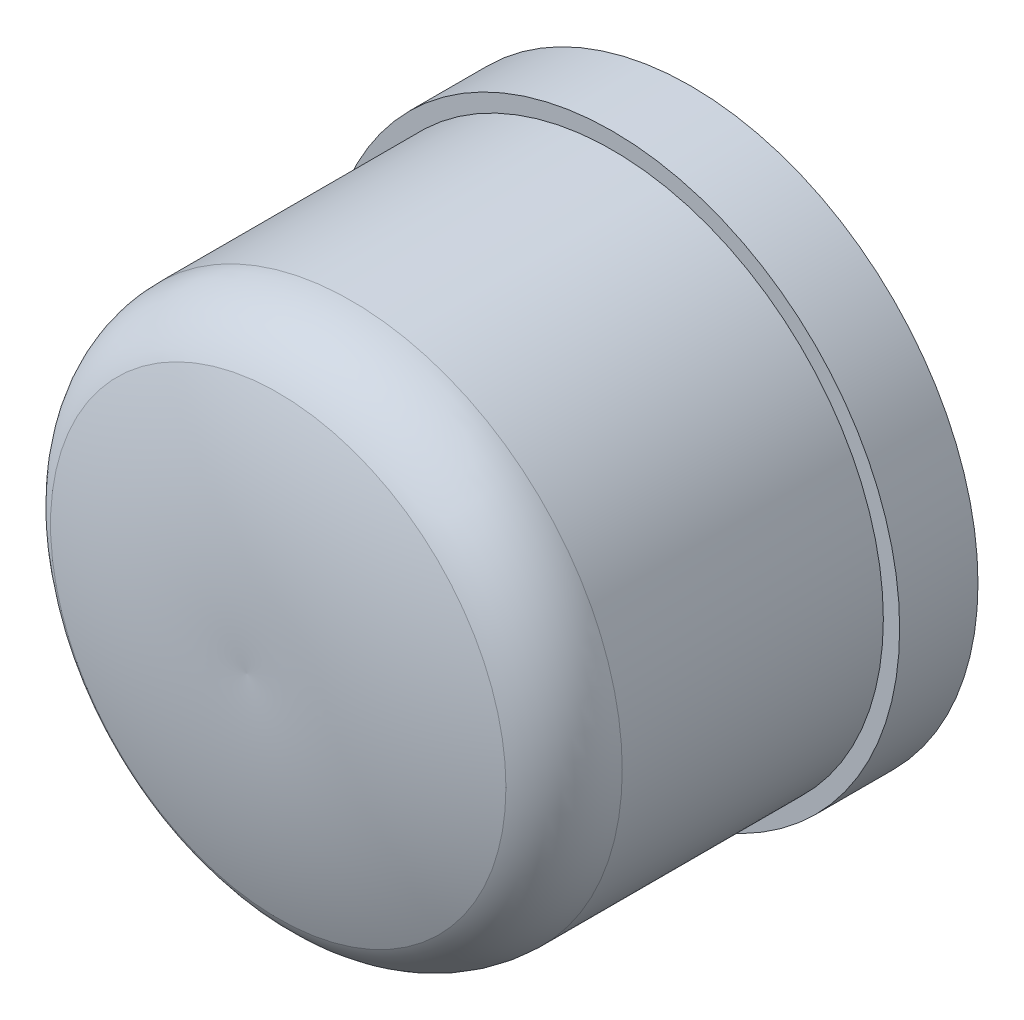
ISO-10303-21;
HEADER;
FILE_DESCRIPTION(('STEP AP214'),'2;1');
FILE_NAME('part.step','',(''),(''),'','','');
FILE_SCHEMA(('AUTOMOTIVE_DESIGN { 1 0 10303 214 1 1 1 1 }'));
ENDSEC;
DATA;
#1=APPLICATION_CONTEXT('core data for automotive mechanical design processes');
#2=APPLICATION_PROTOCOL_DEFINITION('international standard','automotive_design',2000,#1);
#3=PRODUCT_CONTEXT('',#1,'mechanical');
#4=PRODUCT('Part','Part','',(#3));
#5=PRODUCT_RELATED_PRODUCT_CATEGORY('part','',(#4));
#6=PRODUCT_DEFINITION_FORMATION('','',#4);
#7=PRODUCT_DEFINITION_CONTEXT('part definition',#1,'design');
#8=PRODUCT_DEFINITION('design','',#6,#7);
#9=PRODUCT_DEFINITION_SHAPE('','',#8);
#10=(LENGTH_UNIT() NAMED_UNIT(*) SI_UNIT(.MILLI.,.METRE.));
#11=(NAMED_UNIT(*) PLANE_ANGLE_UNIT() SI_UNIT($,.RADIAN.));
#12=(NAMED_UNIT(*) SI_UNIT($,.STERADIAN.) SOLID_ANGLE_UNIT());
#13=UNCERTAINTY_MEASURE_WITH_UNIT(LENGTH_MEASURE(1.E-05),#10,'distance_accuracy_value','');
#14=(GEOMETRIC_REPRESENTATION_CONTEXT(3) GLOBAL_UNCERTAINTY_ASSIGNED_CONTEXT((#13)) GLOBAL_UNIT_ASSIGNED_CONTEXT((#10,
#11,#12)) REPRESENTATION_CONTEXT('',''));
#15=CARTESIAN_POINT('',(0.,0.,0.));
#16=DIRECTION('',(0.,0.,1.));
#17=DIRECTION('',(1.,0.,0.));
#18=AXIS2_PLACEMENT_3D('',#15,#16,#17);
#19=CARTESIAN_POINT('',(0.,16.2745047590158,27.649));
#20=DIRECTION('',(0.,0.,1.));
#21=DIRECTION('',(1.,0.,0.));
#22=AXIS2_PLACEMENT_3D('',#19,#20,#21);
#23=PLANE('',#22);
#24=DIRECTION('',(1.,0.,0.));
#25=VECTOR('',#24,1.);
#26=CARTESIAN_POINT('',(0.,14.6,27.649));
#27=LINE('',#26,#25);
#28=CARTESIAN_POINT('',(1.5,14.6,27.649));
#29=VERTEX_POINT('',#28);
#30=CARTESIAN_POINT('',(-1.5,14.6,27.649));
#31=VERTEX_POINT('',#30);
#32=EDGE_CURVE('E169',#29,#31,#27,.F.);
#33=ORIENTED_EDGE('',*,*,#32,.F.);
#34=DIRECTION('',(0.25881904510251,0.965925826289071,0.));
#35=VECTOR('',#34,1.);
#36=CARTESIAN_POINT('',(1.5,14.6,27.649));
#37=LINE('',#36,#35);
#38=CARTESIAN_POINT('',(1.80801904975527,15.7495427433858,27.649));
#39=VERTEX_POINT('',#38);
#40=EDGE_CURVE('E155',#29,#39,#37,.T.);
#41=ORIENTED_EDGE('',*,*,#40,.T.);
#42=CARTESIAN_POINT('',(0.,0.,27.649));
#43=DIRECTION('',(0.,0.,1.));
#44=DIRECTION('',(1.,0.,0.));
#45=AXIS2_PLACEMENT_3D('',#42,#43,#44);
#46=CIRCLE('',#45,15.8529817230076);
#47=CARTESIAN_POINT('',(-1.80801904975527,15.7495427433857,27.649));
#48=VERTEX_POINT('',#47);
#49=EDGE_CURVE('E19',#39,#48,#46,.T.);
#50=ORIENTED_EDGE('',*,*,#49,.T.);
#51=DIRECTION('',(0.258819045102532,-0.965925826289065,0.));
#52=VECTOR('',#51,1.);
#53=CARTESIAN_POINT('',(-1.80801904975527,15.7495427433857,27.649));
#54=LINE('',#53,#52);
#55=EDGE_CURVE('E172',#48,#31,#54,.T.);
#56=ORIENTED_EDGE('',*,*,#55,.T.);
#57=EDGE_LOOP('',(#33,#41,#50,#56));
#58=FACE_BOUND('',#57,.T.);
#59=ADVANCED_FACE('F16',(#58),#23,.T.);
#60=CARTESIAN_POINT('',(0.,-16.2745047590158,27.649));
#61=DIRECTION('',(0.,0.,1.));
#62=DIRECTION('',(1.,0.,0.));
#63=AXIS2_PLACEMENT_3D('',#60,#61,#62);
#64=PLANE('',#63);
#65=DIRECTION('',(1.,0.,0.));
#66=VECTOR('',#65,1.);
#67=CARTESIAN_POINT('',(0.,-14.6,27.649));
#68=LINE('',#67,#66);
#69=CARTESIAN_POINT('',(-1.5,-14.6,27.649));
#70=VERTEX_POINT('',#69);
#71=CARTESIAN_POINT('',(1.5,-14.6,27.649));
#72=VERTEX_POINT('',#71);
#73=EDGE_CURVE('E182',#70,#72,#68,.T.);
#74=ORIENTED_EDGE('',*,*,#73,.F.);
#75=DIRECTION('',(-0.25881904510251,-0.965925826289071,0.));
#76=VECTOR('',#75,1.);
#77=CARTESIAN_POINT('',(-1.5,-14.6,27.649));
#78=LINE('',#77,#76);
#79=CARTESIAN_POINT('',(-1.80801904975527,-15.7495427433858,27.649));
#80=VERTEX_POINT('',#79);
#81=EDGE_CURVE('E519',#70,#80,#78,.T.);
#82=ORIENTED_EDGE('',*,*,#81,.T.);
#83=CARTESIAN_POINT('',(0.,0.,27.649));
#84=DIRECTION('',(0.,0.,1.));
#85=DIRECTION('',(1.,0.,0.));
#86=AXIS2_PLACEMENT_3D('',#83,#84,#85);
#87=CIRCLE('',#86,15.8529817230076);
#88=CARTESIAN_POINT('',(1.80801904975527,-15.7495427433857,27.649));
#89=VERTEX_POINT('',#88);
#90=EDGE_CURVE('E390',#80,#89,#87,.T.);
#91=ORIENTED_EDGE('',*,*,#90,.T.);
#92=DIRECTION('',(-0.258819045102532,0.965925826289065,0.));
#93=VECTOR('',#92,1.);
#94=CARTESIAN_POINT('',(1.80801904975527,-15.7495427433857,27.649));
#95=LINE('',#94,#93);
#96=EDGE_CURVE('E171',#89,#72,#95,.T.);
#97=ORIENTED_EDGE('',*,*,#96,.T.);
#98=EDGE_LOOP('',(#74,#82,#91,#97));
#99=FACE_BOUND('',#98,.T.);
#100=ADVANCED_FACE('F226',(#99),#64,.T.);
#101=CARTESIAN_POINT('',(16.2745047590158,0.,27.649));
#102=DIRECTION('',(0.,0.,1.));
#103=DIRECTION('',(1.,0.,0.));
#104=AXIS2_PLACEMENT_3D('',#101,#102,#103);
#105=PLANE('',#104);
#106=DIRECTION('',(0.965925826289071,-0.25881904510251,0.));
#107=VECTOR('',#106,1.);
#108=CARTESIAN_POINT('',(14.6,-1.5,27.649));
#109=LINE('',#108,#107);
#110=CARTESIAN_POINT('',(14.6,-1.5,27.649));
#111=VERTEX_POINT('',#110);
#112=CARTESIAN_POINT('',(15.7495427433858,-1.80801904975527,27.649));
#113=VERTEX_POINT('',#112);
#114=EDGE_CURVE('E205',#111,#113,#109,.T.);
#115=ORIENTED_EDGE('',*,*,#114,.T.);
#116=CARTESIAN_POINT('',(0.,0.,27.649));
#117=DIRECTION('',(0.,0.,1.));
#118=DIRECTION('',(1.,0.,0.));
#119=AXIS2_PLACEMENT_3D('',#116,#117,#118);
#120=CIRCLE('',#119,15.8529817230076);
#121=CARTESIAN_POINT('',(15.7495427433857,1.80801904975527,27.649));
#122=VERTEX_POINT('',#121);
#123=EDGE_CURVE('E212',#113,#122,#120,.T.);
#124=ORIENTED_EDGE('',*,*,#123,.T.);
#125=DIRECTION('',(-0.965925826289065,-0.258819045102532,0.));
#126=VECTOR('',#125,1.);
#127=CARTESIAN_POINT('',(15.7495427433857,1.80801904975527,27.649));
#128=LINE('',#127,#126);
#129=CARTESIAN_POINT('',(14.6,1.5,27.649));
#130=VERTEX_POINT('',#129);
#131=EDGE_CURVE('E518',#122,#130,#128,.T.);
#132=ORIENTED_EDGE('',*,*,#131,.T.);
#133=DIRECTION('',(0.,1.,0.));
#134=VECTOR('',#133,1.);
#135=CARTESIAN_POINT('',(14.6,0.,27.649));
#136=LINE('',#135,#134);
#137=EDGE_CURVE('E180',#111,#130,#136,.T.);
#138=ORIENTED_EDGE('',*,*,#137,.F.);
#139=EDGE_LOOP('',(#115,#124,#132,#138));
#140=FACE_BOUND('',#139,.T.);
#141=ADVANCED_FACE('F222',(#140),#105,.T.);
#142=CARTESIAN_POINT('',(5.27580746536688,0.,-9.58054672506245));
#143=DIRECTION('',(0.,1.,0.));
#144=DIRECTION('',(1.,0.,0.));
#145=AXIS2_PLACEMENT_3D('',#142,#143,#144);
#146=CIRCLE('',#145,39.9999999999998);
#147=TRIMMED_CURVE('',#146,(PARAMETER_VALUE(-1.70307695407545)),
(PARAMETER_VALUE(1.70307695407545)),.T.,.PARAMETER.);
#148=CARTESIAN_POINT('',(0.,0.,-9.58054672506245));
#149=DIRECTION('',(0.,0.,1.));
#150=AXIS1_PLACEMENT('',#148,#149);
#151=SURFACE_OF_REVOLUTION('',#147,#150);
#152=CARTESIAN_POINT('',(0.,0.,29.33963362035));
#153=DIRECTION('',(0.,0.,1.));
#154=DIRECTION('',(1.,0.,0.));
#155=AXIS2_PLACEMENT_3D('',#152,#153,#154);
#156=CIRCLE('',#155,14.507251657911);
#157=CARTESIAN_POINT('',(14.507251657911,0.,29.33963362035));
#158=VERTEX_POINT('',#157);
#159=EDGE_CURVE('E208',#158,#158,#156,.F.);
#160=ORIENTED_EDGE('',*,*,#159,.T.);
#161=EDGE_LOOP('',(#160));
#162=FACE_BOUND('',#161,.T.);
#163=CARTESIAN_POINT('',(0.,0.,30.0699999998991));
#164=VERTEX_POINT('',#163);
#165=VERTEX_LOOP('',#164);
#166=FACE_BOUND('',#165,.T.);
#167=ADVANCED_FACE('F217',(#162,#166),#151,.T.);
#168=CARTESIAN_POINT('',(-16.2745047590158,0.,27.649));
#169=DIRECTION('',(0.,0.,1.));
#170=DIRECTION('',(1.,0.,0.));
#171=AXIS2_PLACEMENT_3D('',#168,#169,#170);
#172=PLANE('',#171);
#173=DIRECTION('',(-0.965925826289071,0.25881904510251,0.));
#174=VECTOR('',#173,1.);
#175=CARTESIAN_POINT('',(-14.6,1.5,27.649));
#176=LINE('',#175,#174);
#177=CARTESIAN_POINT('',(-14.6,1.5,27.649));
#178=VERTEX_POINT('',#177);
#179=CARTESIAN_POINT('',(-15.7495427433858,1.80801904975527,27.649));
#180=VERTEX_POINT('',#179);
#181=EDGE_CURVE('E184',#178,#180,#176,.T.);
#182=ORIENTED_EDGE('',*,*,#181,.T.);
#183=CARTESIAN_POINT('',(0.,0.,27.649));
#184=DIRECTION('',(0.,0.,1.));
#185=DIRECTION('',(1.,0.,0.));
#186=AXIS2_PLACEMENT_3D('',#183,#184,#185);
#187=CIRCLE('',#186,15.8529817230076);
#188=CARTESIAN_POINT('',(-15.7495427433857,-1.80801904975527,27.649));
#189=VERTEX_POINT('',#188);
#190=EDGE_CURVE('E211',#180,#189,#187,.T.);
#191=ORIENTED_EDGE('',*,*,#190,.T.);
#192=DIRECTION('',(0.965925826289065,0.258819045102532,0.));
#193=VECTOR('',#192,1.);
#194=CARTESIAN_POINT('',(-15.7495427433857,-1.80801904975527,27.649));
#195=LINE('',#194,#193);
#196=CARTESIAN_POINT('',(-14.6,-1.5,27.649));
#197=VERTEX_POINT('',#196);
#198=EDGE_CURVE('E189',#189,#197,#195,.T.);
#199=ORIENTED_EDGE('',*,*,#198,.T.);
#200=DIRECTION('',(0.,1.,0.));
#201=VECTOR('',#200,1.);
#202=CARTESIAN_POINT('',(-14.6,0.,27.649));
#203=LINE('',#202,#201);
#204=EDGE_CURVE('E389',#178,#197,#203,.F.);
#205=ORIENTED_EDGE('',*,*,#204,.F.);
#206=EDGE_LOOP('',(#182,#191,#199,#205));
#207=FACE_BOUND('',#206,.T.);
#208=ADVANCED_FACE('F221',(#207),#172,.T.);
#209=CARTESIAN_POINT('',(0.,14.6,22.));
#210=DIRECTION('',(0.,-1.,0.));
#211=DIRECTION('',(0.,0.,-1.));
#212=AXIS2_PLACEMENT_3D('',#209,#210,#211);
#213=PLANE('',#212);
#214=DIRECTION('',(1.,0.,0.));
#215=VECTOR('',#214,1.);
#216=CARTESIAN_POINT('',(0.,14.6,22.));
#217=LINE('',#216,#215);
#218=CARTESIAN_POINT('',(-1.5,14.6,22.));
#219=VERTEX_POINT('',#218);
#220=CARTESIAN_POINT('',(1.5,14.6,22.));
#221=VERTEX_POINT('',#220);
#222=EDGE_CURVE('E423',#219,#221,#217,.T.);
#223=ORIENTED_EDGE('',*,*,#222,.T.);
#224=DIRECTION('',(0.,0.,1.));
#225=VECTOR('',#224,1.);
#226=CARTESIAN_POINT('',(1.5,14.6,22.));
#227=LINE('',#226,#225);
#228=EDGE_CURVE('E425',#29,#221,#227,.F.);
#229=ORIENTED_EDGE('',*,*,#228,.F.);
#230=ORIENTED_EDGE('',*,*,#32,.T.);
#231=DIRECTION('',(0.,0.,1.));
#232=VECTOR('',#231,1.);
#233=CARTESIAN_POINT('',(-1.5,14.6,22.));
#234=LINE('',#233,#232);
#235=EDGE_CURVE('E197',#219,#31,#234,.T.);
#236=ORIENTED_EDGE('',*,*,#235,.F.);
#237=EDGE_LOOP('',(#223,#229,#230,#236));
#238=FACE_BOUND('',#237,.T.);
#239=ADVANCED_FACE('F747',(#238),#213,.T.);
#240=CARTESIAN_POINT('',(14.6,0.,22.));
#241=DIRECTION('',(-1.,0.,0.));
#242=DIRECTION('',(0.,0.,1.));
#243=AXIS2_PLACEMENT_3D('',#240,#241,#242);
#244=PLANE('',#243);
#245=DIRECTION('',(0.,1.,0.));
#246=VECTOR('',#245,1.);
#247=CARTESIAN_POINT('',(14.6,0.,22.));
#248=LINE('',#247,#246);
#249=CARTESIAN_POINT('',(14.6,1.5,22.));
#250=VERTEX_POINT('',#249);
#251=CARTESIAN_POINT('',(14.6,-1.5,22.));
#252=VERTEX_POINT('',#251);
#253=EDGE_CURVE('E408',#250,#252,#248,.F.);
#254=ORIENTED_EDGE('',*,*,#253,.T.);
#255=DIRECTION('',(0.,0.,1.));
#256=VECTOR('',#255,1.);
#257=CARTESIAN_POINT('',(14.6,-1.5,22.));
#258=LINE('',#257,#256);
#259=EDGE_CURVE('E410',#111,#252,#258,.F.);
#260=ORIENTED_EDGE('',*,*,#259,.F.);
#261=ORIENTED_EDGE('',*,*,#137,.T.);
#262=DIRECTION('',(0.,0.,1.));
#263=VECTOR('',#262,1.);
#264=CARTESIAN_POINT('',(14.6,1.5,22.));
#265=LINE('',#264,#263);
#266=EDGE_CURVE('E163',#250,#130,#265,.T.);
#267=ORIENTED_EDGE('',*,*,#266,.F.);
#268=EDGE_LOOP('',(#254,#260,#261,#267));
#269=FACE_BOUND('',#268,.T.);
#270=ADVANCED_FACE('F516',(#269),#244,.T.);
#271=CARTESIAN_POINT('',(0.,-14.6,22.));
#272=DIRECTION('',(0.,1.,0.));
#273=DIRECTION('',(0.,0.,1.));
#274=AXIS2_PLACEMENT_3D('',#271,#272,#273);
#275=PLANE('',#274);
#276=DIRECTION('',(1.,0.,0.));
#277=VECTOR('',#276,1.);
#278=CARTESIAN_POINT('',(0.,-14.6,22.));
#279=LINE('',#278,#277);
#280=CARTESIAN_POINT('',(1.5,-14.6,22.));
#281=VERTEX_POINT('',#280);
#282=CARTESIAN_POINT('',(-1.5,-14.6,22.));
#283=VERTEX_POINT('',#282);
#284=EDGE_CURVE('E461',#281,#283,#279,.F.);
#285=ORIENTED_EDGE('',*,*,#284,.T.);
#286=DIRECTION('',(0.,0.,1.));
#287=VECTOR('',#286,1.);
#288=CARTESIAN_POINT('',(-1.5,-14.6,22.));
#289=LINE('',#288,#287);
#290=EDGE_CURVE('E463',#70,#283,#289,.F.);
#291=ORIENTED_EDGE('',*,*,#290,.F.);
#292=ORIENTED_EDGE('',*,*,#73,.T.);
#293=DIRECTION('',(0.,0.,1.));
#294=VECTOR('',#293,1.);
#295=CARTESIAN_POINT('',(1.5,-14.6,22.));
#296=LINE('',#295,#294);
#297=EDGE_CURVE('E344',#281,#72,#296,.T.);
#298=ORIENTED_EDGE('',*,*,#297,.F.);
#299=EDGE_LOOP('',(#285,#291,#292,#298));
#300=FACE_BOUND('',#299,.T.);
#301=ADVANCED_FACE('F730',(#300),#275,.T.);
#302=CARTESIAN_POINT('',(-14.6,0.,22.));
#303=DIRECTION('',(1.,0.,0.));
#304=DIRECTION('',(0.,0.,-1.));
#305=AXIS2_PLACEMENT_3D('',#302,#303,#304);
#306=PLANE('',#305);
#307=DIRECTION('',(0.,1.,0.));
#308=VECTOR('',#307,1.);
#309=CARTESIAN_POINT('',(-14.6,0.,22.));
#310=LINE('',#309,#308);
#311=CARTESIAN_POINT('',(-14.6,-1.5,22.));
#312=VERTEX_POINT('',#311);
#313=CARTESIAN_POINT('',(-14.6,1.5,22.));
#314=VERTEX_POINT('',#313);
#315=EDGE_CURVE('E449',#312,#314,#310,.T.);
#316=ORIENTED_EDGE('',*,*,#315,.T.);
#317=DIRECTION('',(0.,0.,1.));
#318=VECTOR('',#317,1.);
#319=CARTESIAN_POINT('',(-14.6,1.5,22.));
#320=LINE('',#319,#318);
#321=EDGE_CURVE('E386',#178,#314,#320,.F.);
#322=ORIENTED_EDGE('',*,*,#321,.F.);
#323=ORIENTED_EDGE('',*,*,#204,.T.);
#324=DIRECTION('',(0.,0.,1.));
#325=VECTOR('',#324,1.);
#326=CARTESIAN_POINT('',(-14.6,-1.5,22.));
#327=LINE('',#326,#325);
#328=EDGE_CURVE('E304',#312,#197,#327,.T.);
#329=ORIENTED_EDGE('',*,*,#328,.F.);
#330=EDGE_LOOP('',(#316,#322,#323,#329));
#331=FACE_BOUND('',#330,.T.);
#332=ADVANCED_FACE('F721',(#331),#306,.T.);
#333=CARTESIAN_POINT('',(-17.6,2.30384757729337,22.));
#334=DIRECTION('',(0.258819045102521,0.965925826289068,0.));
#335=DIRECTION('',(-0.965925826289068,0.258819045102521,0.));
#336=AXIS2_PLACEMENT_3D('',#333,#334,#335);
#337=PLANE('',#336);
#338=ORIENTED_EDGE('',*,*,#321,.T.);
#339=DIRECTION('',(-0.96592582628907,0.258819045102515,0.));
#340=VECTOR('',#339,1.);
#341=CARTESIAN_POINT('',(-14.6,1.5,22.));
#342=LINE('',#341,#340);
#343=CARTESIAN_POINT('',(-15.990722567619,1.87264298888924,22.));
#344=VERTEX_POINT('',#343);
#345=EDGE_CURVE('E444',#314,#344,#342,.T.);
#346=ORIENTED_EDGE('',*,*,#345,.T.);
#347=DIRECTION('',(0.,0.,-1.));
#348=VECTOR('',#347,1.);
#349=CARTESIAN_POINT('',(-15.990722567619,1.87264298888924,15.3500000000039));
#350=LINE('',#349,#348);
#351=CARTESIAN_POINT('',(-15.9907225675948,1.87264298888275,26.0000000000089));
#352=VERTEX_POINT('',#351);
#353=EDGE_CURVE('E442',#344,#352,#350,.F.);
#354=ORIENTED_EDGE('',*,*,#353,.T.);
#355=CARTESIAN_POINT('',(-15.9907225675705,1.87264298887625,26.0000000000099));
#356=CARTESIAN_POINT('',(-15.9944351229626,1.87363776509541,26.0483005715343));
#357=CARTESIAN_POINT('',(-15.9972215272319,1.87438437986916,26.09667028932));
#358=CARTESIAN_POINT('',(-16.0009391724571,1.87538051990501,26.1935096723445));
#359=CARTESIAN_POINT('',(-16.0018695088419,1.87562980278802,26.2419793747986));
#360=CARTESIAN_POINT('',(-16.0018678644064,1.87562936216286,26.4051325939167));
#361=CARTESIAN_POINT('',(-15.9966578135479,1.87423333324279,26.5198492333094));
#362=CARTESIAN_POINT('',(-15.975859591642,1.86866046647909,26.7483109184947));
#363=CARTESIAN_POINT('',(-15.9602657408261,1.86448210674607,26.8620553980257));
#364=CARTESIAN_POINT('',(-15.9183839033439,1.85325990221519,27.0899792197046));
#365=CARTESIAN_POINT('',(-15.8918713193136,1.84615587673502,27.2041144922179));
#366=CARTESIAN_POINT('',(-15.8284399157876,1.82915948338544,27.429197786812));
#367=CARTESIAN_POINT('',(-15.7915248258293,1.81926811484258,27.5401469355111));
#368=CARTESIAN_POINT('',(-15.7495427433858,1.80801904975528,27.649));
#369=B_SPLINE_CURVE_WITH_KNOTS('',3,(#355,#356,#357,#358,#359,#360,#361,#362,#363,#364,#365,
#366,#367,#368),.UNSPECIFIED.,.F.,.F.,(4,2,2,2,2,2,4),(0.,0.145335956127549,0.290742725730736,
0.63471497959763,0.978875535372544,1.33050017021771,1.6819988995896),.UNSPECIFIED.);
#370=EDGE_CURVE('E199',#352,#180,#369,.T.);
#371=ORIENTED_EDGE('',*,*,#370,.T.);
#372=ORIENTED_EDGE('',*,*,#181,.F.);
#373=EDGE_LOOP('',(#338,#346,#354,#371,#372));
#374=FACE_BOUND('',#373,.T.);
#375=ADVANCED_FACE('F372',(#374),#337,.T.);
#376=CARTESIAN_POINT('',(-1.5,14.6,22.));
#377=DIRECTION('',(-0.965925826289068,-0.258819045102521,0.));
#378=DIRECTION('',(0.258819045102521,-0.965925826289068,0.));
#379=AXIS2_PLACEMENT_3D('',#376,#377,#378);
#380=PLANE('',#379);
#381=ORIENTED_EDGE('',*,*,#55,.F.);
#382=CARTESIAN_POINT('',(-1.80801904975527,15.7495427433858,27.649));
#383=CARTESIAN_POINT('',(-1.81926811484258,15.7915248258292,27.5401469355111));
#384=CARTESIAN_POINT('',(-1.82915948338543,15.8284399157876,27.429197786812));
#385=CARTESIAN_POINT('',(-1.84615587673502,15.8918713193136,27.2041144922179));
#386=CARTESIAN_POINT('',(-1.85325990221519,15.9183839033439,27.0899792197046));
#387=CARTESIAN_POINT('',(-1.86448210674607,15.9602657408261,26.8620553980258));
#388=CARTESIAN_POINT('',(-1.86866046647909,15.975859591642,26.7483109184947));
#389=CARTESIAN_POINT('',(-1.87423333324279,15.9966578135479,26.5198492333094));
#390=CARTESIAN_POINT('',(-1.87562936216285,16.0018678644065,26.4051325939167));
#391=CARTESIAN_POINT('',(-1.87562980278801,16.0018695088419,26.2419793747986));
#392=CARTESIAN_POINT('',(-1.875380519905,16.0009391724571,26.1935096723445));
#393=CARTESIAN_POINT('',(-1.87438437986916,15.9972215272319,26.0966702893199));
#394=CARTESIAN_POINT('',(-1.87363776509542,15.9944351229626,26.0483005715343));
#395=CARTESIAN_POINT('',(-1.87264298887626,15.9907225675705,26.0000000000098));
#396=B_SPLINE_CURVE_WITH_KNOTS('',3,(#382,#383,#384,#385,#386,#387,#388,#389,#390,#391,#392,
#393,#394,#395),.UNSPECIFIED.,.F.,.F.,(4,2,2,2,2,2,4),(0.,0.351498729371898,0.703123364217069,
1.04728391999199,1.39125617385889,1.53666294346211,1.68199889958968),.UNSPECIFIED.);
#397=CARTESIAN_POINT('',(-1.87264298888275,15.9907225675948,26.0000000000089));
#398=VERTEX_POINT('',#397);
#399=EDGE_CURVE('E178',#48,#398,#396,.T.);
#400=ORIENTED_EDGE('',*,*,#399,.T.);
#401=DIRECTION('',(0.,0.,-1.));
#402=VECTOR('',#401,1.);
#403=CARTESIAN_POINT('',(-1.87264298888201,15.9907225676199,15.3500000000039));
#404=LINE('',#403,#402);
#405=CARTESIAN_POINT('',(-1.87264298888563,15.9907225676194,22.));
#406=VERTEX_POINT('',#405);
#407=EDGE_CURVE('E438',#398,#406,#404,.T.);
#408=ORIENTED_EDGE('',*,*,#407,.T.);
#409=DIRECTION('',(0.258819045102515,-0.96592582628907,0.));
#410=VECTOR('',#409,1.);
#411=CARTESIAN_POINT('',(-1.87264298888924,15.990722567619,22.));
#412=LINE('',#411,#410);
#413=EDGE_CURVE('E380',#406,#219,#412,.T.);
#414=ORIENTED_EDGE('',*,*,#413,.T.);
#415=ORIENTED_EDGE('',*,*,#235,.T.);
#416=EDGE_LOOP('',(#381,#400,#408,#414,#415));
#417=FACE_BOUND('',#416,.T.);
#418=ADVANCED_FACE('F367',(#417),#380,.T.);
#419=CARTESIAN_POINT('',(0.,16.2745047590158,22.));
#420=DIRECTION('',(0.,0.,1.));
#421=DIRECTION('',(1.,0.,0.));
#422=AXIS2_PLACEMENT_3D('',#419,#420,#421);
#423=PLANE('',#422);
#424=DIRECTION('',(0.258819045102521,0.965925826289068,0.));
#425=VECTOR('',#424,1.);
#426=CARTESIAN_POINT('',(2.30384757729337,17.6,22.));
#427=LINE('',#426,#425);
#428=CARTESIAN_POINT('',(1.87264298888925,15.990722567619,22.));
#429=VERTEX_POINT('',#428);
#430=EDGE_CURVE('E164',#221,#429,#427,.T.);
#431=ORIENTED_EDGE('',*,*,#430,.F.);
#432=ORIENTED_EDGE('',*,*,#222,.F.);
#433=ORIENTED_EDGE('',*,*,#413,.F.);
#434=CARTESIAN_POINT('',(0.,0.,22.));
#435=DIRECTION('',(0.,0.,-1.));
#436=DIRECTION('',(-1.,0.,0.));
#437=AXIS2_PLACEMENT_3D('',#434,#435,#436);
#438=CIRCLE('',#437,16.0999999999502);
#439=EDGE_CURVE('E305',#406,#429,#438,.T.);
#440=ORIENTED_EDGE('',*,*,#439,.T.);
#441=EDGE_LOOP('',(#431,#432,#433,#440));
#442=FACE_BOUND('',#441,.T.);
#443=ADVANCED_FACE('F364',(#442),#423,.F.);
#444=CARTESIAN_POINT('',(2.30384757729337,17.6,22.));
#445=DIRECTION('',(0.965925826289068,-0.258819045102521,0.));
#446=DIRECTION('',(0.258819045102521,0.965925826289068,0.));
#447=AXIS2_PLACEMENT_3D('',#444,#445,#446);
#448=PLANE('',#447);
#449=ORIENTED_EDGE('',*,*,#228,.T.);
#450=ORIENTED_EDGE('',*,*,#430,.T.);
#451=DIRECTION('',(0.,0.,-1.));
#452=VECTOR('',#451,1.);
#453=CARTESIAN_POINT('',(1.87264298888924,15.990722567619,15.3500000000039));
#454=LINE('',#453,#452);
#455=CARTESIAN_POINT('',(1.87264298888275,15.9907225675948,26.0000000000089));
#456=VERTEX_POINT('',#455);
#457=EDGE_CURVE('E159',#429,#456,#454,.F.);
#458=ORIENTED_EDGE('',*,*,#457,.T.);
#459=CARTESIAN_POINT('',(1.87264298887625,15.9907225675705,26.0000000000099));
#460=CARTESIAN_POINT('',(1.87363776509541,15.9944351229626,26.0483005715343));
#461=CARTESIAN_POINT('',(1.87438437986916,15.9972215272319,26.09667028932));
#462=CARTESIAN_POINT('',(1.87538051990501,16.0009391724571,26.1935096723445));
#463=CARTESIAN_POINT('',(1.87562980278801,16.0018695088419,26.2419793747986));
#464=CARTESIAN_POINT('',(1.87562936216285,16.0018678644065,26.4051325939167));
#465=CARTESIAN_POINT('',(1.87423333324279,15.9966578135479,26.5198492333094));
#466=CARTESIAN_POINT('',(1.86866046647909,15.975859591642,26.7483109184947));
#467=CARTESIAN_POINT('',(1.86448210674607,15.9602657408261,26.8620553980257));
#468=CARTESIAN_POINT('',(1.85325990221519,15.9183839033439,27.0899792197046));
#469=CARTESIAN_POINT('',(1.84615587673502,15.8918713193136,27.2041144922179));
#470=CARTESIAN_POINT('',(1.82915948338543,15.8284399157876,27.429197786812));
#471=CARTESIAN_POINT('',(1.81926811484258,15.7915248258293,27.5401469355111));
#472=CARTESIAN_POINT('',(1.80801904975527,15.7495427433858,27.649));
#473=B_SPLINE_CURVE_WITH_KNOTS('',3,(#459,#460,#461,#462,#463,#464,#465,#466,#467,#468,#469,
#470,#471,#472),.UNSPECIFIED.,.F.,.F.,(4,2,2,2,2,2,4),(0.,0.145335956127548,0.290742725730736,
0.634714979597633,0.978875535372547,1.33050017021771,1.6819988995896),.UNSPECIFIED.);
#474=EDGE_CURVE('E151',#456,#39,#473,.T.);
#475=ORIENTED_EDGE('',*,*,#474,.T.);
#476=ORIENTED_EDGE('',*,*,#40,.F.);
#477=EDGE_LOOP('',(#449,#450,#458,#475,#476));
#478=FACE_BOUND('',#477,.T.);
#479=ADVANCED_FACE('F154',(#478),#448,.T.);
#480=CARTESIAN_POINT('',(14.6,1.5,22.));
#481=DIRECTION('',(-0.258819045102521,0.965925826289068,0.));
#482=DIRECTION('',(-0.965925826289068,-0.258819045102521,0.));
#483=AXIS2_PLACEMENT_3D('',#480,#481,#482);
#484=PLANE('',#483);
#485=ORIENTED_EDGE('',*,*,#131,.F.);
#486=CARTESIAN_POINT('',(15.7495427433858,1.80801904975527,27.649));
#487=CARTESIAN_POINT('',(15.7915248258292,1.81926811484258,27.5401469355111));
#488=CARTESIAN_POINT('',(15.8284399157876,1.82915948338543,27.429197786812));
#489=CARTESIAN_POINT('',(15.8918713193136,1.84615587673502,27.2041144922179));
#490=CARTESIAN_POINT('',(15.9183839033439,1.85325990221519,27.0899792197046));
#491=CARTESIAN_POINT('',(15.9602657408261,1.86448210674607,26.8620553980258));
#492=CARTESIAN_POINT('',(15.975859591642,1.86866046647909,26.7483109184947));
#493=CARTESIAN_POINT('',(15.9966578135479,1.87423333324279,26.5198492333094));
#494=CARTESIAN_POINT('',(16.0018678644065,1.87562936216285,26.4051325939167));
#495=CARTESIAN_POINT('',(16.0018695088419,1.87562980278801,26.2419793747986));
#496=CARTESIAN_POINT('',(16.0009391724571,1.87538051990501,26.1935096723445));
#497=CARTESIAN_POINT('',(15.9972215272319,1.87438437986916,26.0966702893199));
#498=CARTESIAN_POINT('',(15.9944351229626,1.87363776509541,26.0483005715343));
#499=CARTESIAN_POINT('',(15.9907225675705,1.87264298887625,26.0000000000098));
#500=B_SPLINE_CURVE_WITH_KNOTS('',3,(#486,#487,#488,#489,#490,#491,#492,#493,#494,#495,#496,
#497,#498,#499),.UNSPECIFIED.,.F.,.F.,(4,2,2,2,2,2,4),(0.,0.351498729371901,0.703123364217073,
1.04728391999199,1.39125617385889,1.53666294346211,1.68199889958968),.UNSPECIFIED.);
#501=CARTESIAN_POINT('',(15.9907225675948,1.87264298888275,26.0000000000089));
#502=VERTEX_POINT('',#501);
#503=EDGE_CURVE('E346',#122,#502,#500,.T.);
#504=ORIENTED_EDGE('',*,*,#503,.T.);
#505=DIRECTION('',(0.,0.,-1.));
#506=VECTOR('',#505,1.);
#507=CARTESIAN_POINT('',(15.9907225676199,1.87264298888201,15.3500000000039));
#508=LINE('',#507,#506);
#509=CARTESIAN_POINT('',(15.9907225676194,1.87264298888563,22.));
#510=VERTEX_POINT('',#509);
#511=EDGE_CURVE('E496',#502,#510,#508,.T.);
#512=ORIENTED_EDGE('',*,*,#511,.T.);
#513=DIRECTION('',(-0.96592582628907,-0.258819045102515,0.));
#514=VECTOR('',#513,1.);
#515=CARTESIAN_POINT('',(15.990722567619,1.87264298888924,22.));
#516=LINE('',#515,#514);
#517=EDGE_CURVE('E351',#510,#250,#516,.T.);
#518=ORIENTED_EDGE('',*,*,#517,.T.);
#519=ORIENTED_EDGE('',*,*,#266,.T.);
#520=EDGE_LOOP('',(#485,#504,#512,#518,#519));
#521=FACE_BOUND('',#520,.T.);
#522=ADVANCED_FACE('F357',(#521),#484,.T.);
#523=CARTESIAN_POINT('',(16.2745047590158,0.,22.));
#524=DIRECTION('',(0.,0.,1.));
#525=DIRECTION('',(1.,0.,0.));
#526=AXIS2_PLACEMENT_3D('',#523,#524,#525);
#527=PLANE('',#526);
#528=DIRECTION('',(0.965925826289068,-0.258819045102521,0.));
#529=VECTOR('',#528,1.);
#530=CARTESIAN_POINT('',(17.6,-2.30384757729337,22.));
#531=LINE('',#530,#529);
#532=CARTESIAN_POINT('',(15.990722567619,-1.87264298888925,22.));
#533=VERTEX_POINT('',#532);
#534=EDGE_CURVE('E345',#252,#533,#531,.T.);
#535=ORIENTED_EDGE('',*,*,#534,.F.);
#536=ORIENTED_EDGE('',*,*,#253,.F.);
#537=ORIENTED_EDGE('',*,*,#517,.F.);
#538=CARTESIAN_POINT('',(0.,0.,22.));
#539=DIRECTION('',(0.,0.,-1.));
#540=DIRECTION('',(-1.,0.,0.));
#541=AXIS2_PLACEMENT_3D('',#538,#539,#540);
#542=CIRCLE('',#541,16.0999999999502);
#543=EDGE_CURVE('E487',#510,#533,#542,.T.);
#544=ORIENTED_EDGE('',*,*,#543,.T.);
#545=EDGE_LOOP('',(#535,#536,#537,#544));
#546=FACE_BOUND('',#545,.T.);
#547=ADVANCED_FACE('F336',(#546),#527,.F.);
#548=CARTESIAN_POINT('',(17.6,-2.30384757729337,22.));
#549=DIRECTION('',(-0.258819045102521,-0.965925826289068,0.));
#550=DIRECTION('',(0.965925826289068,-0.258819045102521,0.));
#551=AXIS2_PLACEMENT_3D('',#548,#549,#550);
#552=PLANE('',#551);
#553=ORIENTED_EDGE('',*,*,#259,.T.);
#554=ORIENTED_EDGE('',*,*,#534,.T.);
#555=DIRECTION('',(0.,0.,-1.));
#556=VECTOR('',#555,1.);
#557=CARTESIAN_POINT('',(15.990722567619,-1.87264298888924,15.3500000000039));
#558=LINE('',#557,#556);
#559=CARTESIAN_POINT('',(15.9907225675948,-1.87264298888275,26.0000000000089));
#560=VERTEX_POINT('',#559);
#561=EDGE_CURVE('E485',#533,#560,#558,.F.);
#562=ORIENTED_EDGE('',*,*,#561,.T.);
#563=CARTESIAN_POINT('',(15.9907225675705,-1.87264298887626,26.0000000000099));
#564=CARTESIAN_POINT('',(15.9944351229626,-1.87363776509541,26.0483005715343));
#565=CARTESIAN_POINT('',(15.9972215272319,-1.87438437986916,26.09667028932));
#566=CARTESIAN_POINT('',(16.0009391724571,-1.87538051990501,26.1935096723445));
#567=CARTESIAN_POINT('',(16.0018695088419,-1.87562980278802,26.2419793747986));
#568=CARTESIAN_POINT('',(16.0018678644065,-1.87562936216287,26.4051325939167));
#569=CARTESIAN_POINT('',(15.9966578135479,-1.87423333324279,26.5198492333094));
#570=CARTESIAN_POINT('',(15.975859591642,-1.86866046647908,26.7483109184947));
#571=CARTESIAN_POINT('',(15.9602657408261,-1.86448210674607,26.8620553980257));
#572=CARTESIAN_POINT('',(15.9183839033439,-1.8532599022152,27.0899792197046));
#573=CARTESIAN_POINT('',(15.8918713193136,-1.84615587673502,27.2041144922179));
#574=CARTESIAN_POINT('',(15.8284399157876,-1.82915948338544,27.429197786812));
#575=CARTESIAN_POINT('',(15.7915248258293,-1.81926811484258,27.5401469355111));
#576=CARTESIAN_POINT('',(15.7495427433858,-1.80801904975527,27.649));
#577=B_SPLINE_CURVE_WITH_KNOTS('',3,(#563,#564,#565,#566,#567,#568,#569,#570,#571,#572,#573,
#574,#575,#576),.UNSPECIFIED.,.F.,.F.,(4,2,2,2,2,2,4),(0.,0.145335956127548,0.290742725730736,
0.63471497959763,0.978875535372544,1.33050017021771,1.68199889958961),.UNSPECIFIED.);
#578=EDGE_CURVE('E339',#560,#113,#577,.T.);
#579=ORIENTED_EDGE('',*,*,#578,.T.);
#580=ORIENTED_EDGE('',*,*,#114,.F.);
#581=EDGE_LOOP('',(#553,#554,#562,#579,#580));
#582=FACE_BOUND('',#581,.T.);
#583=ADVANCED_FACE('F331',(#582),#552,.T.);
#584=CARTESIAN_POINT('',(1.5,-14.6,22.));
#585=DIRECTION('',(0.965925826289068,0.258819045102521,0.));
#586=DIRECTION('',(-0.258819045102521,0.965925826289068,0.));
#587=AXIS2_PLACEMENT_3D('',#584,#585,#586);
#588=PLANE('',#587);
#589=ORIENTED_EDGE('',*,*,#96,.F.);
#590=CARTESIAN_POINT('',(1.80801904975528,-15.7495427433858,27.649));
#591=CARTESIAN_POINT('',(1.81926811484258,-15.7915248258292,27.5401469355111));
#592=CARTESIAN_POINT('',(1.82915948338543,-15.8284399157876,27.429197786812));
#593=CARTESIAN_POINT('',(1.84615587673502,-15.8918713193136,27.2041144922179));
#594=CARTESIAN_POINT('',(1.85325990221519,-15.9183839033439,27.0899792197046));
#595=CARTESIAN_POINT('',(1.86448210674607,-15.9602657408261,26.8620553980258));
#596=CARTESIAN_POINT('',(1.86866046647909,-15.975859591642,26.7483109184947));
#597=CARTESIAN_POINT('',(1.87423333324279,-15.9966578135479,26.5198492333094));
#598=CARTESIAN_POINT('',(1.87562936216285,-16.0018678644065,26.4051325939167));
#599=CARTESIAN_POINT('',(1.87562980278801,-16.0018695088419,26.2419793747986));
#600=CARTESIAN_POINT('',(1.87538051990501,-16.0009391724571,26.1935096723445));
#601=CARTESIAN_POINT('',(1.87438437986916,-15.9972215272319,26.0966702893199));
#602=CARTESIAN_POINT('',(1.87363776509541,-15.9944351229626,26.0483005715343));
#603=CARTESIAN_POINT('',(1.87264298887624,-15.9907225675705,26.0000000000098));
#604=B_SPLINE_CURVE_WITH_KNOTS('',3,(#590,#591,#592,#593,#594,#595,#596,#597,#598,#599,#600,
#601,#602,#603),.UNSPECIFIED.,.F.,.F.,(4,2,2,2,2,2,4),(0.,0.351498729371901,0.703123364217071,
1.04728391999199,1.39125617385889,1.53666294346211,1.68199889958968),.UNSPECIFIED.);
#605=CARTESIAN_POINT('',(1.87264298888275,-15.9907225675948,26.0000000000089));
#606=VERTEX_POINT('',#605);
#607=EDGE_CURVE('E313',#89,#606,#604,.T.);
#608=ORIENTED_EDGE('',*,*,#607,.T.);
#609=DIRECTION('',(0.,0.,-1.));
#610=VECTOR('',#609,1.);
#611=CARTESIAN_POINT('',(1.87264298888201,-15.9907225676199,15.3500000000039));
#612=LINE('',#611,#610);
#613=CARTESIAN_POINT('',(1.87264298888563,-15.9907225676194,22.));
#614=VERTEX_POINT('',#613);
#615=EDGE_CURVE('E480',#606,#614,#612,.T.);
#616=ORIENTED_EDGE('',*,*,#615,.T.);
#617=DIRECTION('',(-0.258819045102515,0.96592582628907,0.));
#618=VECTOR('',#617,1.);
#619=CARTESIAN_POINT('',(1.87264298888924,-15.990722567619,22.));
#620=LINE('',#619,#618);
#621=EDGE_CURVE('E464',#614,#281,#620,.T.);
#622=ORIENTED_EDGE('',*,*,#621,.T.);
#623=ORIENTED_EDGE('',*,*,#297,.T.);
#624=EDGE_LOOP('',(#589,#608,#616,#622,#623));
#625=FACE_BOUND('',#624,.T.);
#626=ADVANCED_FACE('F326',(#625),#588,.T.);
#627=CARTESIAN_POINT('',(0.,-16.2745047590158,22.));
#628=DIRECTION('',(0.,0.,1.));
#629=DIRECTION('',(1.,0.,0.));
#630=AXIS2_PLACEMENT_3D('',#627,#628,#629);
#631=PLANE('',#630);
#632=DIRECTION('',(-0.258819045102521,-0.965925826289068,0.));
#633=VECTOR('',#632,1.);
#634=CARTESIAN_POINT('',(-2.30384757729337,-17.6,22.));
#635=LINE('',#634,#633);
#636=CARTESIAN_POINT('',(-1.87264298888924,-15.990722567619,22.));
#637=VERTEX_POINT('',#636);
#638=EDGE_CURVE('E312',#283,#637,#635,.T.);
#639=ORIENTED_EDGE('',*,*,#638,.F.);
#640=ORIENTED_EDGE('',*,*,#284,.F.);
#641=ORIENTED_EDGE('',*,*,#621,.F.);
#642=CARTESIAN_POINT('',(0.,0.,22.));
#643=DIRECTION('',(0.,0.,-1.));
#644=DIRECTION('',(-1.,0.,0.));
#645=AXIS2_PLACEMENT_3D('',#642,#643,#644);
#646=CIRCLE('',#645,16.0999999999502);
#647=EDGE_CURVE('E482',#614,#637,#646,.T.);
#648=ORIENTED_EDGE('',*,*,#647,.T.);
#649=EDGE_LOOP('',(#639,#640,#641,#648));
#650=FACE_BOUND('',#649,.T.);
#651=ADVANCED_FACE('F323',(#650),#631,.F.);
#652=CARTESIAN_POINT('',(-2.30384757729337,-17.6,22.));
#653=DIRECTION('',(-0.965925826289068,0.258819045102521,0.));
#654=DIRECTION('',(-0.258819045102521,-0.965925826289068,0.));
#655=AXIS2_PLACEMENT_3D('',#652,#653,#654);
#656=PLANE('',#655);
#657=ORIENTED_EDGE('',*,*,#290,.T.);
#658=ORIENTED_EDGE('',*,*,#638,.T.);
#659=DIRECTION('',(0.,0.,-1.));
#660=VECTOR('',#659,1.);
#661=CARTESIAN_POINT('',(-1.87264298888923,-15.990722567619,15.3500000000039));
#662=LINE('',#661,#660);
#663=CARTESIAN_POINT('',(-1.87264298888274,-15.9907225675948,26.0000000000089));
#664=VERTEX_POINT('',#663);
#665=EDGE_CURVE('E473',#637,#664,#662,.F.);
#666=ORIENTED_EDGE('',*,*,#665,.T.);
#667=CARTESIAN_POINT('',(-1.87264298887626,-15.9907225675705,26.0000000000099));
#668=CARTESIAN_POINT('',(-1.87363776509541,-15.9944351229626,26.0483005715343));
#669=CARTESIAN_POINT('',(-1.87438437986916,-15.9972215272319,26.09667028932));
#670=CARTESIAN_POINT('',(-1.87538051990501,-16.0009391724571,26.1935096723445));
#671=CARTESIAN_POINT('',(-1.87562980278802,-16.0018695088419,26.2419793747986));
#672=CARTESIAN_POINT('',(-1.87562936216287,-16.0018678644065,26.4051325939167));
#673=CARTESIAN_POINT('',(-1.87423333324279,-15.9966578135479,26.5198492333094));
#674=CARTESIAN_POINT('',(-1.86866046647909,-15.975859591642,26.7483109184947));
#675=CARTESIAN_POINT('',(-1.86448210674607,-15.9602657408261,26.8620553980257));
#676=CARTESIAN_POINT('',(-1.8532599022152,-15.9183839033439,27.0899792197046));
#677=CARTESIAN_POINT('',(-1.84615587673502,-15.8918713193136,27.2041144922179));
#678=CARTESIAN_POINT('',(-1.82915948338543,-15.8284399157876,27.429197786812));
#679=CARTESIAN_POINT('',(-1.81926811484258,-15.7915248258293,27.5401469355111));
#680=CARTESIAN_POINT('',(-1.80801904975526,-15.7495427433858,27.649));
#681=B_SPLINE_CURVE_WITH_KNOTS('',3,(#667,#668,#669,#670,#671,#672,#673,#674,#675,#676,#677,
#678,#679,#680),.UNSPECIFIED.,.F.,.F.,(4,2,2,2,2,2,4),(0.,0.145335956127548,0.290742725730736,
0.63471497959763,0.978875535372544,1.33050017021771,1.68199889958961),.UNSPECIFIED.);
#682=EDGE_CURVE('E307',#664,#80,#681,.T.);
#683=ORIENTED_EDGE('',*,*,#682,.T.);
#684=ORIENTED_EDGE('',*,*,#81,.F.);
#685=EDGE_LOOP('',(#657,#658,#666,#683,#684));
#686=FACE_BOUND('',#685,.T.);
#687=ADVANCED_FACE('F319',(#686),#656,.T.);
#688=CARTESIAN_POINT('',(0.,0.,26.2904562841154));
#689=DIRECTION('',(0.,0.,1.));
#690=DIRECTION('',(1.,0.,0.));
#691=AXIS2_PLACEMENT_3D('',#688,#689,#690);
#692=TOROIDAL_SURFACE('',#691,12.4114182742201,3.69999999999996);
#693=ORIENTED_EDGE('',*,*,#159,.F.);
#694=EDGE_LOOP('',(#693));
#695=FACE_BOUND('',#694,.T.);
#696=ORIENTED_EDGE('',*,*,#682,.F.);
#697=CARTESIAN_POINT('',(0.,0.,26.0000000000079));
#698=DIRECTION('',(0.,0.,-1.));
#699=DIRECTION('',(-1.,0.,0.));
#700=AXIS2_PLACEMENT_3D('',#697,#698,#699);
#701=CIRCLE('',#700,16.0999999999502);
#702=CARTESIAN_POINT('',(-15.9907225675948,-1.87264298888275,26.0000000000089));
#703=VERTEX_POINT('',#702);
#704=EDGE_CURVE('E550',#664,#703,#701,.T.);
#705=ORIENTED_EDGE('',*,*,#704,.T.);
#706=CARTESIAN_POINT('',(-15.7495427433858,-1.80801904975527,27.649));
#707=CARTESIAN_POINT('',(-15.7915248258292,-1.81926811484258,27.5401469355111));
#708=CARTESIAN_POINT('',(-15.8284399157876,-1.82915948338543,27.429197786812));
#709=CARTESIAN_POINT('',(-15.8918713193136,-1.84615587673502,27.2041144922179));
#710=CARTESIAN_POINT('',(-15.9183839033439,-1.85325990221519,27.0899792197046));
#711=CARTESIAN_POINT('',(-15.9602657408261,-1.86448210674607,26.8620553980258));
#712=CARTESIAN_POINT('',(-15.975859591642,-1.86866046647909,26.7483109184947));
#713=CARTESIAN_POINT('',(-15.9966578135479,-1.87423333324279,26.5198492333094));
#714=CARTESIAN_POINT('',(-16.0018678644065,-1.87562936216285,26.4051325939167));
#715=CARTESIAN_POINT('',(-16.0018695088419,-1.87562980278801,26.2419793747986));
#716=CARTESIAN_POINT('',(-16.0009391724571,-1.87538051990501,26.1935096723445));
#717=CARTESIAN_POINT('',(-15.9972215272319,-1.87438437986916,26.0966702893199));
#718=CARTESIAN_POINT('',(-15.9944351229626,-1.87363776509542,26.0483005715343));
#719=CARTESIAN_POINT('',(-15.9907225675705,-1.87264298887626,26.0000000000098));
#720=B_SPLINE_CURVE_WITH_KNOTS('',3,(#706,#707,#708,#709,#710,#711,#712,#713,#714,#715,#716,
#717,#718,#719),.UNSPECIFIED.,.F.,.F.,(4,2,2,2,2,2,4),(0.,0.351498729371901,0.70312336421707,
1.04728391999199,1.39125617385889,1.53666294346211,1.68199889958968),.UNSPECIFIED.);
#721=EDGE_CURVE('E296',#189,#703,#720,.T.);
#722=ORIENTED_EDGE('',*,*,#721,.F.);
#723=ORIENTED_EDGE('',*,*,#190,.F.);
#724=ORIENTED_EDGE('',*,*,#370,.F.);
#725=CARTESIAN_POINT('',(0.,0.,26.0000000000079));
#726=DIRECTION('',(0.,0.,-1.));
#727=DIRECTION('',(-1.,0.,0.));
#728=AXIS2_PLACEMENT_3D('',#725,#726,#727);
#729=CIRCLE('',#728,16.0999999999502);
#730=EDGE_CURVE('E440',#352,#398,#729,.T.);
#731=ORIENTED_EDGE('',*,*,#730,.T.);
#732=ORIENTED_EDGE('',*,*,#399,.F.);
#733=ORIENTED_EDGE('',*,*,#49,.F.);
#734=ORIENTED_EDGE('',*,*,#474,.F.);
#735=CARTESIAN_POINT('',(0.,0.,26.0000000000079));
#736=DIRECTION('',(0.,0.,-1.));
#737=DIRECTION('',(-1.,0.,0.));
#738=AXIS2_PLACEMENT_3D('',#735,#736,#737);
#739=CIRCLE('',#738,16.0999999999502);
#740=EDGE_CURVE('E498',#456,#502,#739,.T.);
#741=ORIENTED_EDGE('',*,*,#740,.T.);
#742=ORIENTED_EDGE('',*,*,#503,.F.);
#743=ORIENTED_EDGE('',*,*,#123,.F.);
#744=ORIENTED_EDGE('',*,*,#578,.F.);
#745=CARTESIAN_POINT('',(0.,0.,26.0000000000079));
#746=DIRECTION('',(0.,0.,-1.));
#747=DIRECTION('',(-1.,0.,0.));
#748=AXIS2_PLACEMENT_3D('',#745,#746,#747);
#749=CIRCLE('',#748,16.0999999999502);
#750=EDGE_CURVE('E483',#560,#606,#749,.T.);
#751=ORIENTED_EDGE('',*,*,#750,.T.);
#752=ORIENTED_EDGE('',*,*,#607,.F.);
#753=ORIENTED_EDGE('',*,*,#90,.F.);
#754=EDGE_LOOP('',(#696,#705,#722,#723,#724,#731,#732,#733,#734,#741,#742,#743,#744,#751,#752,#753));
#755=FACE_BOUND('',#754,.T.);
#756=ADVANCED_FACE('F176',(#695,#755),#692,.F.);
#757=CARTESIAN_POINT('',(-14.6,-1.5,22.));
#758=DIRECTION('',(0.258819045102521,-0.965925826289068,0.));
#759=DIRECTION('',(0.965925826289068,0.258819045102521,0.));
#760=AXIS2_PLACEMENT_3D('',#757,#758,#759);
#761=PLANE('',#760);
#762=ORIENTED_EDGE('',*,*,#198,.F.);
#763=ORIENTED_EDGE('',*,*,#721,.T.);
#764=DIRECTION('',(0.,0.,-1.));
#765=VECTOR('',#764,1.);
#766=CARTESIAN_POINT('',(-15.9907225676199,-1.87264298888201,15.3500000000039));
#767=LINE('',#766,#765);
#768=CARTESIAN_POINT('',(-15.9907225676194,-1.87264298888563,22.));
#769=VERTEX_POINT('',#768);
#770=EDGE_CURVE('E547',#703,#769,#767,.T.);
#771=ORIENTED_EDGE('',*,*,#770,.T.);
#772=DIRECTION('',(0.96592582628907,0.258819045102515,0.));
#773=VECTOR('',#772,1.);
#774=CARTESIAN_POINT('',(-15.990722567619,-1.87264298888924,22.));
#775=LINE('',#774,#773);
#776=EDGE_CURVE('E303',#769,#312,#775,.T.);
#777=ORIENTED_EDGE('',*,*,#776,.T.);
#778=ORIENTED_EDGE('',*,*,#328,.T.);
#779=EDGE_LOOP('',(#762,#763,#771,#777,#778));
#780=FACE_BOUND('',#779,.T.);
#781=ADVANCED_FACE('F286',(#780),#761,.T.);
#782=CARTESIAN_POINT('',(-16.2745047590158,0.,22.));
#783=DIRECTION('',(0.,0.,1.));
#784=DIRECTION('',(1.,0.,0.));
#785=AXIS2_PLACEMENT_3D('',#782,#783,#784);
#786=PLANE('',#785);
#787=ORIENTED_EDGE('',*,*,#345,.F.);
#788=ORIENTED_EDGE('',*,*,#315,.F.);
#789=ORIENTED_EDGE('',*,*,#776,.F.);
#790=CARTESIAN_POINT('',(0.,0.,22.));
#791=DIRECTION('',(0.,0.,-1.));
#792=DIRECTION('',(-1.,0.,0.));
#793=AXIS2_PLACEMENT_3D('',#790,#791,#792);
#794=CIRCLE('',#793,16.0999999999502);
#795=EDGE_CURVE('E545',#769,#344,#794,.T.);
#796=ORIENTED_EDGE('',*,*,#795,.T.);
#797=EDGE_LOOP('',(#787,#788,#789,#796));
#798=FACE_BOUND('',#797,.T.);
#799=ADVANCED_FACE('F282',(#798),#786,.F.);
#800=CARTESIAN_POINT('',(0.,0.,15.3500000000039));
#801=DIRECTION('',(0.,0.,-1.));
#802=DIRECTION('',(-1.,0.,0.));
#803=AXIS2_PLACEMENT_3D('',#800,#801,#802);
#804=CYLINDRICAL_SURFACE('',#803,16.0999999999502);
#805=CARTESIAN_POINT('',(0.,0.,4.69999999999905));
#806=DIRECTION('',(0.,0.,1.));
#807=DIRECTION('',(1.,0.,0.));
#808=AXIS2_PLACEMENT_3D('',#805,#806,#807);
#809=CIRCLE('',#808,16.1000000001);
#810=CARTESIAN_POINT('',(16.1000000001,0.,4.69999999999905));
#811=VERTEX_POINT('',#810);
#812=EDGE_CURVE('E544',#811,#811,#809,.T.);
#813=ORIENTED_EDGE('',*,*,#812,.F.);
#814=EDGE_LOOP('',(#813));
#815=FACE_BOUND('',#814,.T.);
#816=ORIENTED_EDGE('',*,*,#353,.F.);
#817=ORIENTED_EDGE('',*,*,#795,.F.);
#818=ORIENTED_EDGE('',*,*,#770,.F.);
#819=ORIENTED_EDGE('',*,*,#704,.F.);
#820=ORIENTED_EDGE('',*,*,#665,.F.);
#821=ORIENTED_EDGE('',*,*,#647,.F.);
#822=ORIENTED_EDGE('',*,*,#615,.F.);
#823=ORIENTED_EDGE('',*,*,#750,.F.);
#824=ORIENTED_EDGE('',*,*,#561,.F.);
#825=ORIENTED_EDGE('',*,*,#543,.F.);
#826=ORIENTED_EDGE('',*,*,#511,.F.);
#827=ORIENTED_EDGE('',*,*,#740,.F.);
#828=ORIENTED_EDGE('',*,*,#457,.F.);
#829=ORIENTED_EDGE('',*,*,#439,.F.);
#830=ORIENTED_EDGE('',*,*,#407,.F.);
#831=ORIENTED_EDGE('',*,*,#730,.F.);
#832=EDGE_LOOP('',(#816,#817,#818,#819,#820,#821,#822,#823,#824,#825,#826,#827,#828,#829,#830,#831));
#833=FACE_BOUND('',#832,.T.);
#834=ADVANCED_FACE('F278',(#815,#833),#804,.F.);
#835=CARTESIAN_POINT('',(0.,0.,4.46054069435007));
#836=DIRECTION('',(0.,0.,1.));
#837=DIRECTION('',(1.,0.,0.));
#838=AXIS2_PLACEMENT_3D('',#835,#836,#837);
#839=TOROIDAL_SURFACE('',#838,41.0988531586135,24.9999999999996);
#840=ORIENTED_EDGE('',*,*,#812,.T.);
#841=EDGE_LOOP('',(#840));
#842=FACE_BOUND('',#841,.T.);
#843=CARTESIAN_POINT('',(0.,0.,0.));
#844=DIRECTION('',(0.,0.,1.));
#845=DIRECTION('',(1.,0.,0.));
#846=AXIS2_PLACEMENT_3D('',#843,#844,#845);
#847=CIRCLE('',#846,16.5000000001017);
#848=CARTESIAN_POINT('',(16.5000000001017,0.,0.));
#849=VERTEX_POINT('',#848);
#850=EDGE_CURVE('E541',#849,#849,#847,.T.);
#851=ORIENTED_EDGE('',*,*,#850,.F.);
#852=EDGE_LOOP('',(#851));
#853=FACE_BOUND('',#852,.T.);
#854=ADVANCED_FACE('F274',(#842,#853),#839,.T.);
#855=CARTESIAN_POINT('',(19.25,0.,0.));
#856=DIRECTION('',(0.,0.,-1.));
#857=DIRECTION('',(-1.,0.,0.));
#858=AXIS2_PLACEMENT_3D('',#855,#856,#857);
#859=PLANE('',#858);
#860=ORIENTED_EDGE('',*,*,#850,.T.);
#861=EDGE_LOOP('',(#860));
#862=FACE_BOUND('',#861,.T.);
#863=CARTESIAN_POINT('',(0.,0.,0.));
#864=DIRECTION('',(0.,0.,-1.));
#865=DIRECTION('',(-1.,0.,0.));
#866=AXIS2_PLACEMENT_3D('',#863,#864,#865);
#867=CIRCLE('',#866,22.);
#868=CARTESIAN_POINT('',(-22.,0.,0.));
#869=VERTEX_POINT('',#868);
#870=EDGE_CURVE('E262',#869,#869,#867,.F.);
#871=ORIENTED_EDGE('',*,*,#870,.F.);
#872=EDGE_LOOP('',(#871));
#873=FACE_BOUND('',#872,.T.);
#874=ADVANCED_FACE('F270',(#862,#873),#859,.T.);
#875=CARTESIAN_POINT('',(2.86236680876951,0.,-9.83664855187745));
#876=DIRECTION('',(0.,1.,0.));
#877=DIRECTION('',(1.,0.,0.));
#878=AXIS2_PLACEMENT_3D('',#875,#876,#877);
#879=CIRCLE('',#878,43.9299999999997);
#880=TRIMMED_CURVE('',#879,(PARAMETER_VALUE(-1.63599997004232)),
(PARAMETER_VALUE(1.63599997004232)),.T.,.PARAMETER.);
#881=CARTESIAN_POINT('',(0.,0.,-9.83664855187745));
#882=DIRECTION('',(0.,0.,1.));
#883=AXIS1_PLACEMENT('',#881,#882);
#884=SURFACE_OF_REVOLUTION('',#880,#883);
#885=CARTESIAN_POINT('',(0.,0.,31.6032256258982));
#886=DIRECTION('',(0.,0.,1.));
#887=DIRECTION('',(1.,0.,0.));
#888=AXIS2_PLACEMENT_3D('',#885,#886,#887);
#889=CIRCLE('',#888,17.4425495281399);
#890=CARTESIAN_POINT('',(17.4425495281399,0.,31.6032256258982));
#891=VERTEX_POINT('',#890);
#892=EDGE_CURVE('E258',#891,#891,#889,.F.);
#893=ORIENTED_EDGE('',*,*,#892,.F.);
#894=EDGE_LOOP('',(#893));
#895=FACE_BOUND('',#894,.T.);
#896=CARTESIAN_POINT('',(0.,0.,33.9999999998997));
#897=VERTEX_POINT('',#896);
#898=VERTEX_LOOP('',#897);
#899=FACE_BOUND('',#898,.T.);
#900=ADVANCED_FACE('F267',(#895,#899),#884,.F.);
#901=CARTESIAN_POINT('',(0.,0.,3.));
#902=DIRECTION('',(0.,0.,-1.));
#903=DIRECTION('',(-1.,0.,0.));
#904=AXIS2_PLACEMENT_3D('',#901,#902,#903);
#905=CYLINDRICAL_SURFACE('',#904,22.);
#906=CARTESIAN_POINT('',(0.,0.,6.));
#907=DIRECTION('',(0.,0.,-1.));
#908=DIRECTION('',(-1.,0.,0.));
#909=AXIS2_PLACEMENT_3D('',#906,#907,#908);
#910=CIRCLE('',#909,22.);
#911=CARTESIAN_POINT('',(-22.,0.,6.));
#912=VERTEX_POINT('',#911);
#913=EDGE_CURVE('E261',#912,#912,#910,.F.);
#914=ORIENTED_EDGE('',*,*,#913,.F.);
#915=EDGE_LOOP('',(#914));
#916=FACE_BOUND('',#915,.T.);
#917=ORIENTED_EDGE('',*,*,#870,.T.);
#918=EDGE_LOOP('',(#917));
#919=FACE_BOUND('',#918,.T.);
#920=ADVANCED_FACE('F252',(#916,#919),#905,.T.);
#921=CARTESIAN_POINT('',(0.,0.,25.999999999941));
#922=DIRECTION('',(0.,0.,1.));
#923=DIRECTION('',(1.,0.,0.));
#924=AXIS2_PLACEMENT_3D('',#921,#922,#923);
#925=TOROIDAL_SURFACE('',#924,14.3499999999,6.40000000000002);
#926=ORIENTED_EDGE('',*,*,#892,.T.);
#927=EDGE_LOOP('',(#926));
#928=FACE_BOUND('',#927,.T.);
#929=CARTESIAN_POINT('',(0.,0.,26.));
#930=DIRECTION('',(0.,0.,-1.));
#931=DIRECTION('',(-1.,0.,0.));
#932=AXIS2_PLACEMENT_3D('',#929,#930,#931);
#933=CIRCLE('',#932,20.75);
#934=CARTESIAN_POINT('',(-20.75,0.,26.));
#935=VERTEX_POINT('',#934);
#936=EDGE_CURVE('E25',#935,#935,#933,.T.);
#937=ORIENTED_EDGE('',*,*,#936,.F.);
#938=EDGE_LOOP('',(#937));
#939=FACE_BOUND('',#938,.T.);
#940=ADVANCED_FACE('F243',(#928,#939),#925,.T.);
#941=CARTESIAN_POINT('',(21.375,0.,6.));
#942=DIRECTION('',(0.,0.,1.));
#943=DIRECTION('',(1.,0.,0.));
#944=AXIS2_PLACEMENT_3D('',#941,#942,#943);
#945=PLANE('',#944);
#946=ORIENTED_EDGE('',*,*,#913,.T.);
#947=EDGE_LOOP('',(#946));
#948=FACE_BOUND('',#947,.T.);
#949=CARTESIAN_POINT('',(0.,0.,6.));
#950=DIRECTION('',(0.,0.,-1.));
#951=DIRECTION('',(-1.,0.,0.));
#952=AXIS2_PLACEMENT_3D('',#949,#950,#951);
#953=CIRCLE('',#952,20.75);
#954=CARTESIAN_POINT('',(-20.75,0.,6.));
#955=VERTEX_POINT('',#954);
#956=EDGE_CURVE('E11',#955,#955,#953,.F.);
#957=ORIENTED_EDGE('',*,*,#956,.F.);
#958=EDGE_LOOP('',(#957));
#959=FACE_BOUND('',#958,.T.);
#960=ADVANCED_FACE('F237',(#948,#959),#945,.T.);
#961=CARTESIAN_POINT('',(0.,0.,16.));
#962=DIRECTION('',(0.,0.,-1.));
#963=DIRECTION('',(-1.,0.,0.));
#964=AXIS2_PLACEMENT_3D('',#961,#962,#963);
#965=CYLINDRICAL_SURFACE('',#964,20.75);
#966=ORIENTED_EDGE('',*,*,#936,.T.);
#967=EDGE_LOOP('',(#966));
#968=FACE_BOUND('',#967,.T.);
#969=ORIENTED_EDGE('',*,*,#956,.T.);
#970=EDGE_LOOP('',(#969));
#971=FACE_BOUND('',#970,.T.);
#972=ADVANCED_FACE('F235',(#968,#971),#965,.T.);
#973=CLOSED_SHELL('',(#59,#100,#141,#167,#208,#239,#270,#301,#332,#375,#418,#443,#479,#522,#547,
#583,#626,#651,#687,#756,#781,#799,#834,#854,#874,#900,#920,#940,#960,#972));
#974=MANIFOLD_SOLID_BREP('B1',#973);
#975=ADVANCED_BREP_SHAPE_REPRESENTATION('',(#18,#974),#14);
#976=SHAPE_DEFINITION_REPRESENTATION(#9,#975);
ENDSEC;
END-ISO-10303-21;
